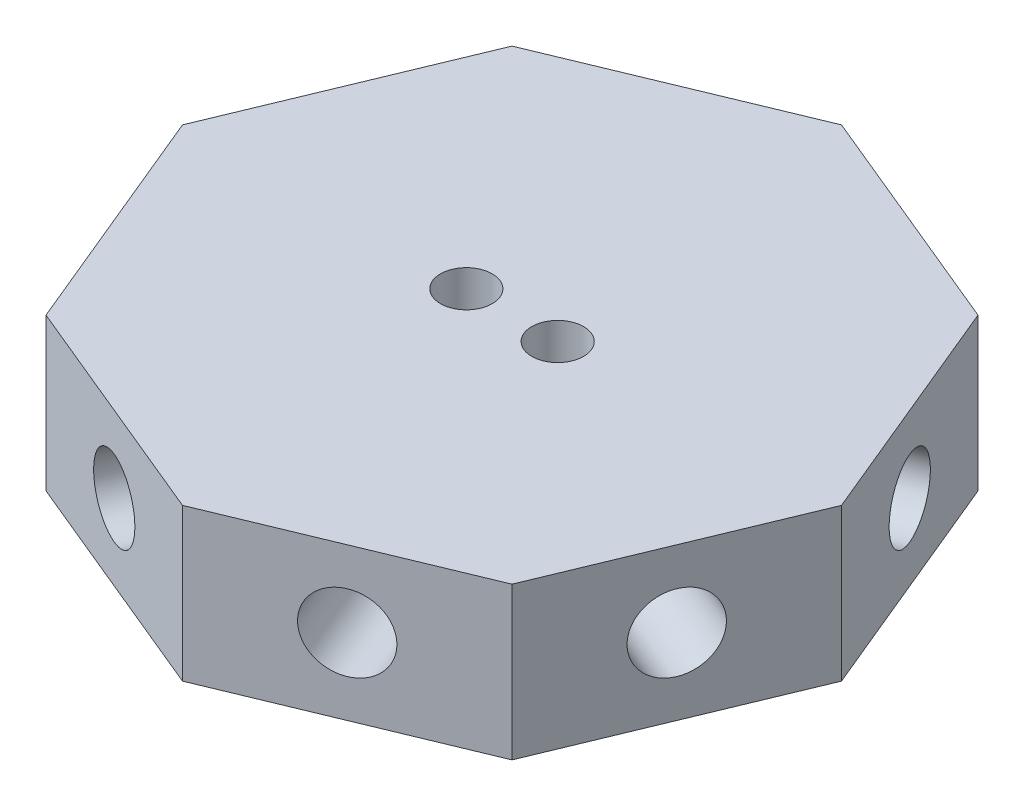
ISO-10303-21;
HEADER;
FILE_DESCRIPTION(('STEP AP214'),'2;1');
FILE_NAME('part.step','',(''),(''),'','','');
FILE_SCHEMA(('AUTOMOTIVE_DESIGN { 1 0 10303 214 1 1 1 1 }'));
ENDSEC;
DATA;
#1=APPLICATION_CONTEXT('core data for automotive mechanical design processes');
#2=APPLICATION_PROTOCOL_DEFINITION('international standard','automotive_design',2000,#1);
#3=PRODUCT_CONTEXT('',#1,'mechanical');
#4=PRODUCT('Part','Part','',(#3));
#5=PRODUCT_RELATED_PRODUCT_CATEGORY('part','',(#4));
#6=PRODUCT_DEFINITION_FORMATION('','',#4);
#7=PRODUCT_DEFINITION_CONTEXT('part definition',#1,'design');
#8=PRODUCT_DEFINITION('design','',#6,#7);
#9=PRODUCT_DEFINITION_SHAPE('','',#8);
#10=(LENGTH_UNIT() NAMED_UNIT(*) SI_UNIT(.MILLI.,.METRE.));
#11=(NAMED_UNIT(*) PLANE_ANGLE_UNIT() SI_UNIT($,.RADIAN.));
#12=(NAMED_UNIT(*) SI_UNIT($,.STERADIAN.) SOLID_ANGLE_UNIT());
#13=UNCERTAINTY_MEASURE_WITH_UNIT(LENGTH_MEASURE(1.E-05),#10,'distance_accuracy_value','');
#14=(GEOMETRIC_REPRESENTATION_CONTEXT(3) GLOBAL_UNCERTAINTY_ASSIGNED_CONTEXT((#13)) GLOBAL_UNIT_ASSIGNED_CONTEXT((#10,
#11,#12)) REPRESENTATION_CONTEXT('',''));
#15=CARTESIAN_POINT('',(0.,0.,0.));
#16=DIRECTION('',(0.,0.,1.));
#17=DIRECTION('',(1.,0.,0.));
#18=AXIS2_PLACEMENT_3D('',#15,#16,#17);
#19=CARTESIAN_POINT('',(0.,6.35,0.));
#20=DIRECTION('',(0.,1.,0.));
#21=DIRECTION('',(0.,0.,1.));
#22=AXIS2_PLACEMENT_3D('',#19,#20,#21);
#23=PLANE('',#22);
#24=CARTESIAN_POINT('',(1.905,6.35,0.));
#25=DIRECTION('',(0.,1.,0.));
#26=DIRECTION('',(0.,0.,1.));
#27=AXIS2_PLACEMENT_3D('',#24,#25,#26);
#28=CIRCLE('',#27,1.0795);
#29=CARTESIAN_POINT('',(1.905,6.35,1.0795));
#30=VERTEX_POINT('',#29);
#31=EDGE_CURVE('E152',#30,#30,#28,.T.);
#32=ORIENTED_EDGE('',*,*,#31,.F.);
#33=EDGE_LOOP('',(#32));
#34=FACE_BOUND('',#33,.T.);
#35=DIRECTION('',(-0.923879532511291,0.,-0.38268343236508));
#36=VECTOR('',#35,1.);
#37=CARTESIAN_POINT('',(9.72015918207318,6.35,-9.72015918207338));
#38=LINE('',#37,#36);
#39=CARTESIAN_POINT('',(9.72015918207318,6.35,-9.72015918207338));
#40=VERTEX_POINT('',#39);
#41=CARTESIAN_POINT('',(-1.37932681645812E-13,6.35,-13.7463809437134));
#42=VERTEX_POINT('',#41);
#43=EDGE_CURVE('E170',#40,#42,#38,.T.);
#44=ORIENTED_EDGE('',*,*,#43,.T.);
#45=DIRECTION('',(-0.923879532511283,0.,0.382683432365099));
#46=VECTOR('',#45,1.);
#47=CARTESIAN_POINT('',(-1.37932681645812E-13,6.35,-13.7463809437134));
#48=LINE('',#47,#46);
#49=CARTESIAN_POINT('',(-9.72015918207337,6.35,-9.72015918207318));
#50=VERTEX_POINT('',#49);
#51=EDGE_CURVE('E106',#42,#50,#48,.T.);
#52=ORIENTED_EDGE('',*,*,#51,.T.);
#53=DIRECTION('',(-0.38268343236508,0.,0.923879532511291));
#54=VECTOR('',#53,1.);
#55=CARTESIAN_POINT('',(-9.72015918207337,6.35,-9.72015918207318));
#56=LINE('',#55,#54);
#57=CARTESIAN_POINT('',(-13.7463809437134,6.35,1.37932681645812E-13));
#58=VERTEX_POINT('',#57);
#59=EDGE_CURVE('E191',#50,#58,#56,.T.);
#60=ORIENTED_EDGE('',*,*,#59,.T.);
#61=DIRECTION('',(0.382683432365099,0.,0.923879532511283));
#62=VECTOR('',#61,1.);
#63=CARTESIAN_POINT('',(-13.7463809437134,6.35,1.37932681645812E-13));
#64=LINE('',#63,#62);
#65=CARTESIAN_POINT('',(-9.72015918207318,6.35,9.72015918207337));
#66=VERTEX_POINT('',#65);
#67=EDGE_CURVE('E205',#58,#66,#64,.T.);
#68=ORIENTED_EDGE('',*,*,#67,.T.);
#69=DIRECTION('',(0.923879532511291,0.,0.38268343236508));
#70=VECTOR('',#69,1.);
#71=CARTESIAN_POINT('',(-9.72015918207318,6.35,9.72015918207337));
#72=LINE('',#71,#70);
#73=CARTESIAN_POINT('',(1.37337229226791E-13,6.35,13.7463809437134));
#74=VERTEX_POINT('',#73);
#75=EDGE_CURVE('E125',#66,#74,#72,.T.);
#76=ORIENTED_EDGE('',*,*,#75,.T.);
#77=DIRECTION('',(0.923879532511283,0.,-0.382683432365099));
#78=VECTOR('',#77,1.);
#79=CARTESIAN_POINT('',(1.37337229226791E-13,6.35,13.7463809437134));
#80=LINE('',#79,#78);
#81=CARTESIAN_POINT('',(9.72015918207338,6.35,9.72015918207318));
#82=VERTEX_POINT('',#81);
#83=EDGE_CURVE('E119',#74,#82,#80,.T.);
#84=ORIENTED_EDGE('',*,*,#83,.T.);
#85=DIRECTION('',(0.382683432365081,0.,-0.923879532511291));
#86=VECTOR('',#85,1.);
#87=CARTESIAN_POINT('',(9.72015918207338,6.35,9.72015918207318));
#88=LINE('',#87,#86);
#89=CARTESIAN_POINT('',(13.7463809437134,6.35,-1.34091256162712E-13));
#90=VERTEX_POINT('',#89);
#91=EDGE_CURVE('E123',#82,#90,#88,.T.);
#92=ORIENTED_EDGE('',*,*,#91,.T.);
#93=DIRECTION('',(-0.382683432365099,0.,-0.923879532511283));
#94=VECTOR('',#93,1.);
#95=CARTESIAN_POINT('',(13.7463809437134,6.35,-1.34091256162712E-13));
#96=LINE('',#95,#94);
#97=EDGE_CURVE('E63',#90,#40,#96,.T.);
#98=ORIENTED_EDGE('',*,*,#97,.T.);
#99=EDGE_LOOP('',(#44,#52,#60,#68,#76,#84,#92,#98));
#100=FACE_BOUND('',#99,.T.);
#101=CARTESIAN_POINT('',(-1.905,6.35,0.));
#102=DIRECTION('',(0.,1.,0.));
#103=DIRECTION('',(0.,0.,1.));
#104=AXIS2_PLACEMENT_3D('',#101,#102,#103);
#105=CIRCLE('',#104,1.0795);
#106=CARTESIAN_POINT('',(-1.905,6.35,1.0795));
#107=VERTEX_POINT('',#106);
#108=EDGE_CURVE('E219',#107,#107,#105,.T.);
#109=ORIENTED_EDGE('',*,*,#108,.F.);
#110=EDGE_LOOP('',(#109));
#111=FACE_BOUND('',#110,.T.);
#112=ADVANCED_FACE('F45',(#34,#100,#111),#23,.T.);
#113=CARTESIAN_POINT('',(0.,0.,0.));
#114=DIRECTION('',(0.,1.,0.));
#115=DIRECTION('',(0.,0.,1.));
#116=AXIS2_PLACEMENT_3D('',#113,#114,#115);
#117=PLANE('',#116);
#118=DIRECTION('',(-0.923879532511291,0.,-0.38268343236508));
#119=VECTOR('',#118,1.);
#120=CARTESIAN_POINT('',(9.72015918207318,0.,-9.72015918207338));
#121=LINE('',#120,#119);
#122=CARTESIAN_POINT('',(9.72015918207318,0.,-9.72015918207338));
#123=VERTEX_POINT('',#122);
#124=CARTESIAN_POINT('',(-1.37932681645812E-13,0.,-13.7463809437134));
#125=VERTEX_POINT('',#124);
#126=EDGE_CURVE('E147',#123,#125,#121,.T.);
#127=ORIENTED_EDGE('',*,*,#126,.F.);
#128=DIRECTION('',(-0.382683432365099,0.,-0.923879532511283));
#129=VECTOR('',#128,1.);
#130=CARTESIAN_POINT('',(13.7463809437134,0.,-1.34091256162712E-13));
#131=LINE('',#130,#129);
#132=CARTESIAN_POINT('',(13.7463809437134,0.,-1.34091256162712E-13));
#133=VERTEX_POINT('',#132);
#134=EDGE_CURVE('E98',#133,#123,#131,.T.);
#135=ORIENTED_EDGE('',*,*,#134,.F.);
#136=DIRECTION('',(0.382683432365081,0.,-0.923879532511291));
#137=VECTOR('',#136,1.);
#138=CARTESIAN_POINT('',(9.72015918207338,0.,9.72015918207318));
#139=LINE('',#138,#137);
#140=CARTESIAN_POINT('',(9.72015918207338,0.,9.72015918207318));
#141=VERTEX_POINT('',#140);
#142=EDGE_CURVE('E92',#141,#133,#139,.T.);
#143=ORIENTED_EDGE('',*,*,#142,.F.);
#144=DIRECTION('',(0.923879532511283,0.,-0.382683432365099));
#145=VECTOR('',#144,1.);
#146=CARTESIAN_POINT('',(1.37337229226791E-13,0.,13.7463809437134));
#147=LINE('',#146,#145);
#148=CARTESIAN_POINT('',(1.37337229226791E-13,0.,13.7463809437134));
#149=VERTEX_POINT('',#148);
#150=EDGE_CURVE('E134',#149,#141,#147,.T.);
#151=ORIENTED_EDGE('',*,*,#150,.F.);
#152=DIRECTION('',(0.923879532511291,0.,0.38268343236508));
#153=VECTOR('',#152,1.);
#154=CARTESIAN_POINT('',(-9.72015918207318,0.,9.72015918207337));
#155=LINE('',#154,#153);
#156=CARTESIAN_POINT('',(-9.72015918207318,0.,9.72015918207337));
#157=VERTEX_POINT('',#156);
#158=EDGE_CURVE('E161',#157,#149,#155,.T.);
#159=ORIENTED_EDGE('',*,*,#158,.F.);
#160=DIRECTION('',(0.382683432365099,0.,0.923879532511283));
#161=VECTOR('',#160,1.);
#162=CARTESIAN_POINT('',(-13.7463809437134,0.,1.37932681645812E-13));
#163=LINE('',#162,#161);
#164=CARTESIAN_POINT('',(-13.7463809437134,0.,1.37932681645812E-13));
#165=VERTEX_POINT('',#164);
#166=EDGE_CURVE('E158',#165,#157,#163,.T.);
#167=ORIENTED_EDGE('',*,*,#166,.F.);
#168=DIRECTION('',(-0.38268343236508,0.,0.923879532511291));
#169=VECTOR('',#168,1.);
#170=CARTESIAN_POINT('',(-9.72015918207337,0.,-9.72015918207318));
#171=LINE('',#170,#169);
#172=CARTESIAN_POINT('',(-9.72015918207337,0.,-9.72015918207318));
#173=VERTEX_POINT('',#172);
#174=EDGE_CURVE('E155',#173,#165,#171,.T.);
#175=ORIENTED_EDGE('',*,*,#174,.F.);
#176=DIRECTION('',(-0.923879532511283,0.,0.382683432365099));
#177=VECTOR('',#176,1.);
#178=CARTESIAN_POINT('',(-1.37932681645812E-13,0.,-13.7463809437134));
#179=LINE('',#178,#177);
#180=EDGE_CURVE('E151',#125,#173,#179,.T.);
#181=ORIENTED_EDGE('',*,*,#180,.F.);
#182=EDGE_LOOP('',(#127,#135,#143,#151,#159,#167,#175,#181));
#183=FACE_BOUND('',#182,.T.);
#184=CARTESIAN_POINT('',(1.905,0.,0.));
#185=DIRECTION('',(0.,1.,0.));
#186=DIRECTION('',(0.,0.,1.));
#187=AXIS2_PLACEMENT_3D('',#184,#185,#186);
#188=CIRCLE('',#187,1.0795);
#189=CARTESIAN_POINT('',(1.905,0.,1.0795));
#190=VERTEX_POINT('',#189);
#191=EDGE_CURVE('E215',#190,#190,#188,.T.);
#192=ORIENTED_EDGE('',*,*,#191,.T.);
#193=EDGE_LOOP('',(#192));
#194=FACE_BOUND('',#193,.T.);
#195=CARTESIAN_POINT('',(-1.905,0.,0.));
#196=DIRECTION('',(0.,1.,0.));
#197=DIRECTION('',(0.,0.,1.));
#198=AXIS2_PLACEMENT_3D('',#195,#196,#197);
#199=CIRCLE('',#198,1.0795);
#200=CARTESIAN_POINT('',(-1.905,0.,1.0795));
#201=VERTEX_POINT('',#200);
#202=EDGE_CURVE('E223',#201,#201,#199,.T.);
#203=ORIENTED_EDGE('',*,*,#202,.T.);
#204=EDGE_LOOP('',(#203));
#205=FACE_BOUND('',#204,.T.);
#206=ADVANCED_FACE('F195',(#183,#194,#205),#117,.F.);
#207=CARTESIAN_POINT('',(9.72015918207318,6.35,-9.72015918207338));
#208=DIRECTION('',(-0.38268343236508,0.,0.923879532511291));
#209=DIRECTION('',(0.923879532511291,0.,0.38268343236508));
#210=AXIS2_PLACEMENT_3D('',#207,#208,#209);
#211=PLANE('',#210);
#212=CARTESIAN_POINT('',(4.86007959103652,3.175,-11.7332700628934));
#213=DIRECTION('',(0.382683432365081,0.,-0.923879532511291));
#214=DIRECTION('',(-0.923879532511291,0.,-0.382683432365081));
#215=AXIS2_PLACEMENT_3D('',#212,#213,#214);
#216=CIRCLE('',#215,1.5875);
#217=CARTESIAN_POINT('',(3.39342083317485,3.175,-12.340780011773));
#218=VERTEX_POINT('',#217);
#219=EDGE_CURVE('E272',#218,#218,#216,.T.);
#220=ORIENTED_EDGE('',*,*,#219,.F.);
#221=EDGE_LOOP('',(#220));
#222=FACE_BOUND('',#221,.T.);
#223=ORIENTED_EDGE('',*,*,#126,.T.);
#224=DIRECTION('',(0.,-1.,0.));
#225=VECTOR('',#224,1.);
#226=CARTESIAN_POINT('',(-1.37932681645812E-13,6.35,-13.7463809437134));
#227=LINE('',#226,#225);
#228=EDGE_CURVE('E11',#42,#125,#227,.T.);
#229=ORIENTED_EDGE('',*,*,#228,.F.);
#230=ORIENTED_EDGE('',*,*,#43,.F.);
#231=DIRECTION('',(0.,-1.,0.));
#232=VECTOR('',#231,1.);
#233=CARTESIAN_POINT('',(9.72015918207318,6.35,-9.72015918207338));
#234=LINE('',#233,#232);
#235=EDGE_CURVE('E143',#40,#123,#234,.T.);
#236=ORIENTED_EDGE('',*,*,#235,.T.);
#237=EDGE_LOOP('',(#223,#229,#230,#236));
#238=FACE_BOUND('',#237,.T.);
#239=ADVANCED_FACE('F47',(#222,#238),#211,.F.);
#240=CARTESIAN_POINT('',(-1.37932681645812E-13,6.35,-13.7463809437134));
#241=DIRECTION('',(0.382683432365099,0.,0.923879532511283));
#242=DIRECTION('',(0.923879532511283,0.,-0.382683432365099));
#243=AXIS2_PLACEMENT_3D('',#240,#241,#242);
#244=PLANE('',#243);
#245=CARTESIAN_POINT('',(-4.86007959103686,3.175,-11.7332700628932));
#246=DIRECTION('',(-0.382683432365107,0.,-0.92387953251128));
#247=DIRECTION('',(-0.92387953251128,0.,0.382683432365107));
#248=AXIS2_PLACEMENT_3D('',#245,#246,#247);
#249=CIRCLE('',#248,1.5875);
#250=CARTESIAN_POINT('',(-6.32673834889851,3.175,-11.1257601140136));
#251=VERTEX_POINT('',#250);
#252=EDGE_CURVE('E263',#251,#251,#249,.T.);
#253=ORIENTED_EDGE('',*,*,#252,.F.);
#254=EDGE_LOOP('',(#253));
#255=FACE_BOUND('',#254,.T.);
#256=ORIENTED_EDGE('',*,*,#180,.T.);
#257=DIRECTION('',(0.,-1.,0.));
#258=VECTOR('',#257,1.);
#259=CARTESIAN_POINT('',(-9.72015918207337,6.35,-9.72015918207318));
#260=LINE('',#259,#258);
#261=EDGE_CURVE('E55',#50,#173,#260,.T.);
#262=ORIENTED_EDGE('',*,*,#261,.F.);
#263=ORIENTED_EDGE('',*,*,#51,.F.);
#264=ORIENTED_EDGE('',*,*,#228,.T.);
#265=EDGE_LOOP('',(#256,#262,#263,#264));
#266=FACE_BOUND('',#265,.T.);
#267=ADVANCED_FACE('F305',(#255,#266),#244,.F.);
#268=CARTESIAN_POINT('',(-9.72015918207337,6.35,-9.72015918207318));
#269=DIRECTION('',(0.923879532511291,0.,0.38268343236508));
#270=DIRECTION('',(0.38268343236508,0.,-0.923879532511291));
#271=AXIS2_PLACEMENT_3D('',#268,#269,#270);
#272=PLANE('',#271);
#273=CARTESIAN_POINT('',(-11.7332700628934,3.175,-4.8600795910364));
#274=DIRECTION('',(-0.923879532511295,0.,-0.382683432365071));
#275=DIRECTION('',(-0.382683432365071,0.,0.923879532511295));
#276=AXIS2_PLACEMENT_3D('',#273,#274,#275);
#277=CIRCLE('',#276,1.5875);
#278=CARTESIAN_POINT('',(-12.340780011773,3.175,-3.39342083317472));
#279=VERTEX_POINT('',#278);
#280=EDGE_CURVE('E287',#279,#279,#277,.T.);
#281=ORIENTED_EDGE('',*,*,#280,.F.);
#282=EDGE_LOOP('',(#281));
#283=FACE_BOUND('',#282,.T.);
#284=ORIENTED_EDGE('',*,*,#174,.T.);
#285=DIRECTION('',(0.,-1.,0.));
#286=VECTOR('',#285,1.);
#287=CARTESIAN_POINT('',(-13.7463809437134,6.35,1.37932681645812E-13));
#288=LINE('',#287,#286);
#289=EDGE_CURVE('E181',#58,#165,#288,.T.);
#290=ORIENTED_EDGE('',*,*,#289,.F.);
#291=ORIENTED_EDGE('',*,*,#59,.F.);
#292=ORIENTED_EDGE('',*,*,#261,.T.);
#293=EDGE_LOOP('',(#284,#290,#291,#292));
#294=FACE_BOUND('',#293,.T.);
#295=ADVANCED_FACE('F189',(#283,#294),#272,.F.);
#296=CARTESIAN_POINT('',(-13.7463809437134,6.35,1.37932681645812E-13));
#297=DIRECTION('',(0.923879532511283,0.,-0.382683432365099));
#298=DIRECTION('',(-0.382683432365099,0.,-0.923879532511283));
#299=AXIS2_PLACEMENT_3D('',#296,#297,#298);
#300=PLANE('',#299);
#301=CARTESIAN_POINT('',(-11.7332700628932,3.175,4.8600795910369));
#302=DIRECTION('',(-0.923879532511278,0.,0.38268343236511));
#303=DIRECTION('',(0.38268343236511,0.,0.923879532511278));
#304=AXIS2_PLACEMENT_3D('',#301,#302,#303);
#305=CIRCLE('',#304,1.5875);
#306=CARTESIAN_POINT('',(-11.1257601140136,3.175,6.32673834889855));
#307=VERTEX_POINT('',#306);
#308=EDGE_CURVE('E279',#307,#307,#305,.T.);
#309=ORIENTED_EDGE('',*,*,#308,.F.);
#310=EDGE_LOOP('',(#309));
#311=FACE_BOUND('',#310,.T.);
#312=ORIENTED_EDGE('',*,*,#166,.T.);
#313=DIRECTION('',(0.,-1.,0.));
#314=VECTOR('',#313,1.);
#315=CARTESIAN_POINT('',(-9.72015918207318,6.35,9.72015918207337));
#316=LINE('',#315,#314);
#317=EDGE_CURVE('E177',#66,#157,#316,.T.);
#318=ORIENTED_EDGE('',*,*,#317,.F.);
#319=ORIENTED_EDGE('',*,*,#67,.F.);
#320=ORIENTED_EDGE('',*,*,#289,.T.);
#321=EDGE_LOOP('',(#312,#318,#319,#320));
#322=FACE_BOUND('',#321,.T.);
#323=ADVANCED_FACE('F200',(#311,#322),#300,.F.);
#324=CARTESIAN_POINT('',(-9.72015918207318,6.35,9.72015918207337));
#325=DIRECTION('',(0.38268343236508,0.,-0.923879532511291));
#326=DIRECTION('',(-0.923879532511291,0.,-0.382683432365081));
#327=AXIS2_PLACEMENT_3D('',#324,#325,#326);
#328=PLANE('',#327);
#329=CARTESIAN_POINT('',(-4.86007959103652,3.175,11.7332700628934));
#330=DIRECTION('',(-0.382683432365081,0.,0.923879532511291));
#331=DIRECTION('',(0.923879532511291,0.,0.382683432365081));
#332=AXIS2_PLACEMENT_3D('',#329,#330,#331);
#333=CIRCLE('',#332,1.5875);
#334=CARTESIAN_POINT('',(-3.39342083317485,3.175,12.340780011773));
#335=VERTEX_POINT('',#334);
#336=EDGE_CURVE('E231',#335,#335,#333,.T.);
#337=ORIENTED_EDGE('',*,*,#336,.F.);
#338=EDGE_LOOP('',(#337));
#339=FACE_BOUND('',#338,.T.);
#340=ORIENTED_EDGE('',*,*,#158,.T.);
#341=DIRECTION('',(0.,-1.,0.));
#342=VECTOR('',#341,1.);
#343=CARTESIAN_POINT('',(1.37337229226791E-13,6.35,13.7463809437134));
#344=LINE('',#343,#342);
#345=EDGE_CURVE('E136',#74,#149,#344,.T.);
#346=ORIENTED_EDGE('',*,*,#345,.F.);
#347=ORIENTED_EDGE('',*,*,#75,.F.);
#348=ORIENTED_EDGE('',*,*,#317,.T.);
#349=EDGE_LOOP('',(#340,#346,#347,#348));
#350=FACE_BOUND('',#349,.T.);
#351=ADVANCED_FACE('F203',(#339,#350),#328,.F.);
#352=CARTESIAN_POINT('',(1.37337229226791E-13,6.35,13.7463809437134));
#353=DIRECTION('',(-0.382683432365099,0.,-0.923879532511283));
#354=DIRECTION('',(-0.923879532511283,0.,0.382683432365099));
#355=AXIS2_PLACEMENT_3D('',#352,#353,#354);
#356=PLANE('',#355);
#357=CARTESIAN_POINT('',(4.86007959103678,3.175,11.7332700628933));
#358=DIRECTION('',(0.3826834323651,0.,0.923879532511282));
#359=DIRECTION('',(0.923879532511282,0.,-0.3826834323651));
#360=AXIS2_PLACEMENT_3D('',#357,#358,#359);
#361=CIRCLE('',#360,1.5875);
#362=CARTESIAN_POINT('',(6.32673834889844,3.175,11.1257601140137));
#363=VERTEX_POINT('',#362);
#364=EDGE_CURVE('E239',#363,#363,#361,.T.);
#365=ORIENTED_EDGE('',*,*,#364,.F.);
#366=EDGE_LOOP('',(#365));
#367=FACE_BOUND('',#366,.T.);
#368=ORIENTED_EDGE('',*,*,#150,.T.);
#369=DIRECTION('',(0.,-1.,0.));
#370=VECTOR('',#369,1.);
#371=CARTESIAN_POINT('',(9.72015918207338,6.35,9.72015918207318));
#372=LINE('',#371,#370);
#373=EDGE_CURVE('E131',#82,#141,#372,.T.);
#374=ORIENTED_EDGE('',*,*,#373,.F.);
#375=ORIENTED_EDGE('',*,*,#83,.F.);
#376=ORIENTED_EDGE('',*,*,#345,.T.);
#377=EDGE_LOOP('',(#368,#374,#375,#376));
#378=FACE_BOUND('',#377,.T.);
#379=ADVANCED_FACE('F132',(#367,#378),#356,.F.);
#380=CARTESIAN_POINT('',(9.72015918207338,6.35,9.72015918207318));
#381=DIRECTION('',(-0.923879532511291,0.,-0.382683432365081));
#382=DIRECTION('',(-0.382683432365081,0.,0.923879532511291));
#383=AXIS2_PLACEMENT_3D('',#380,#381,#382);
#384=PLANE('',#383);
#385=CARTESIAN_POINT('',(11.7332700628934,3.175,4.86007959103648));
#386=DIRECTION('',(0.923879532511292,0.,0.382683432365077));
#387=DIRECTION('',(0.382683432365077,0.,-0.923879532511292));
#388=AXIS2_PLACEMENT_3D('',#385,#386,#387);
#389=CIRCLE('',#388,1.5875);
#390=CARTESIAN_POINT('',(12.340780011773,3.175,3.39342083317481));
#391=VERTEX_POINT('',#390);
#392=EDGE_CURVE('E256',#391,#391,#389,.T.);
#393=ORIENTED_EDGE('',*,*,#392,.F.);
#394=EDGE_LOOP('',(#393));
#395=FACE_BOUND('',#394,.T.);
#396=ORIENTED_EDGE('',*,*,#142,.T.);
#397=DIRECTION('',(0.,-1.,0.));
#398=VECTOR('',#397,1.);
#399=CARTESIAN_POINT('',(13.7463809437134,6.35,-1.34091256162712E-13));
#400=LINE('',#399,#398);
#401=EDGE_CURVE('E137',#90,#133,#400,.T.);
#402=ORIENTED_EDGE('',*,*,#401,.F.);
#403=ORIENTED_EDGE('',*,*,#91,.F.);
#404=ORIENTED_EDGE('',*,*,#373,.T.);
#405=EDGE_LOOP('',(#396,#402,#403,#404));
#406=FACE_BOUND('',#405,.T.);
#407=ADVANCED_FACE('F139',(#395,#406),#384,.F.);
#408=CARTESIAN_POINT('',(13.7463809437134,6.35,-1.34091256162712E-13));
#409=DIRECTION('',(-0.923879532511283,0.,0.382683432365099));
#410=DIRECTION('',(0.382683432365099,0.,0.923879532511283));
#411=AXIS2_PLACEMENT_3D('',#408,#409,#410);
#412=PLANE('',#411);
#413=CARTESIAN_POINT('',(11.7332700628933,3.175,-4.86007959103682));
#414=DIRECTION('',(0.923879532511281,0.,-0.382683432365104));
#415=DIRECTION('',(-0.382683432365104,0.,-0.923879532511281));
#416=AXIS2_PLACEMENT_3D('',#413,#414,#415);
#417=CIRCLE('',#416,1.5875);
#418=CARTESIAN_POINT('',(11.1257601140137,3.175,-6.32673834889847));
#419=VERTEX_POINT('',#418);
#420=EDGE_CURVE('E247',#419,#419,#417,.T.);
#421=ORIENTED_EDGE('',*,*,#420,.F.);
#422=EDGE_LOOP('',(#421));
#423=FACE_BOUND('',#422,.T.);
#424=ORIENTED_EDGE('',*,*,#134,.T.);
#425=ORIENTED_EDGE('',*,*,#235,.F.);
#426=ORIENTED_EDGE('',*,*,#97,.F.);
#427=ORIENTED_EDGE('',*,*,#401,.T.);
#428=EDGE_LOOP('',(#424,#425,#426,#427));
#429=FACE_BOUND('',#428,.T.);
#430=ADVANCED_FACE('F326',(#423,#429),#412,.F.);
#431=CARTESIAN_POINT('',(1.905,6.35,0.));
#432=DIRECTION('',(0.,-1.,0.));
#433=DIRECTION('',(0.,0.,-1.));
#434=AXIS2_PLACEMENT_3D('',#431,#432,#433);
#435=CYLINDRICAL_SURFACE('',#434,1.0795);
#436=ORIENTED_EDGE('',*,*,#31,.T.);
#437=EDGE_LOOP('',(#436));
#438=FACE_BOUND('',#437,.T.);
#439=ORIENTED_EDGE('',*,*,#191,.F.);
#440=EDGE_LOOP('',(#439));
#441=FACE_BOUND('',#440,.T.);
#442=ADVANCED_FACE('F323',(#438,#441),#435,.F.);
#443=CARTESIAN_POINT('',(-1.905,6.35,0.));
#444=DIRECTION('',(0.,-1.,0.));
#445=DIRECTION('',(0.,0.,-1.));
#446=AXIS2_PLACEMENT_3D('',#443,#444,#445);
#447=CYLINDRICAL_SURFACE('',#446,1.0795);
#448=ORIENTED_EDGE('',*,*,#108,.T.);
#449=EDGE_LOOP('',(#448));
#450=FACE_BOUND('',#449,.T.);
#451=ORIENTED_EDGE('',*,*,#202,.F.);
#452=EDGE_LOOP('',(#451));
#453=FACE_BOUND('',#452,.T.);
#454=ADVANCED_FACE('F346',(#450,#453),#447,.F.);
#455=CARTESIAN_POINT('',(-1.94403183641461,3.175,4.69330802515735));
#456=DIRECTION('',(-0.382683432365081,0.,0.923879532511291));
#457=DIRECTION('',(0.923879532511291,0.,0.382683432365081));
#458=AXIS2_PLACEMENT_3D('',#455,#456,#457);
#459=CYLINDRICAL_SURFACE('',#458,1.5875);
#460=CARTESIAN_POINT('',(-1.94403183641461,3.175,4.69330802515735));
#461=DIRECTION('',(-0.382683432365081,0.,0.923879532511291));
#462=DIRECTION('',(0.923879532511291,0.,0.382683432365081));
#463=AXIS2_PLACEMENT_3D('',#460,#461,#462);
#464=CIRCLE('',#463,1.5875);
#465=CARTESIAN_POINT('',(-0.477373078552936,3.175,5.30081797403692));
#466=VERTEX_POINT('',#465);
#467=EDGE_CURVE('E227',#466,#466,#464,.T.);
#468=ORIENTED_EDGE('',*,*,#467,.F.);
#469=EDGE_LOOP('',(#468));
#470=FACE_BOUND('',#469,.T.);
#471=ORIENTED_EDGE('',*,*,#336,.T.);
#472=EDGE_LOOP('',(#471));
#473=FACE_BOUND('',#472,.T.);
#474=ADVANCED_FACE('F344',(#470,#473),#459,.F.);
#475=CARTESIAN_POINT('',(-1.94403183641461,3.175,4.69330802515735));
#476=DIRECTION('',(-0.382683432365081,0.,0.923879532511291));
#477=DIRECTION('',(0.923879532511291,0.,0.382683432365081));
#478=AXIS2_PLACEMENT_3D('',#475,#476,#477);
#479=PLANE('',#478);
#480=ORIENTED_EDGE('',*,*,#467,.T.);
#481=EDGE_LOOP('',(#480));
#482=FACE_BOUND('',#481,.T.);
#483=ADVANCED_FACE('F345',(#482),#479,.T.);
#484=CARTESIAN_POINT('',(4.69330802515731,3.175,-1.94403183641473));
#485=DIRECTION('',(0.923879532511281,0.,-0.382683432365104));
#486=DIRECTION('',(-0.382683432365104,0.,-0.923879532511281));
#487=AXIS2_PLACEMENT_3D('',#484,#485,#486);
#488=CYLINDRICAL_SURFACE('',#487,1.5875);
#489=CARTESIAN_POINT('',(4.69330802515731,3.175,-1.94403183641473));
#490=DIRECTION('',(0.923879532511281,0.,-0.382683432365104));
#491=DIRECTION('',(-0.382683432365104,0.,-0.923879532511281));
#492=AXIS2_PLACEMENT_3D('',#489,#490,#491);
#493=CIRCLE('',#492,1.5875);
#494=CARTESIAN_POINT('',(4.0857980762777,3.175,-3.41069059427638));
#495=VERTEX_POINT('',#494);
#496=EDGE_CURVE('E251',#495,#495,#493,.T.);
#497=ORIENTED_EDGE('',*,*,#496,.F.);
#498=EDGE_LOOP('',(#497));
#499=FACE_BOUND('',#498,.T.);
#500=ORIENTED_EDGE('',*,*,#420,.T.);
#501=EDGE_LOOP('',(#500));
#502=FACE_BOUND('',#501,.T.);
#503=ADVANCED_FACE('F352',(#499,#502),#488,.F.);
#504=CARTESIAN_POINT('',(4.69330802515731,3.175,-1.94403183641473));
#505=DIRECTION('',(0.923879532511281,0.,-0.382683432365104));
#506=DIRECTION('',(-0.382683432365104,0.,-0.923879532511281));
#507=AXIS2_PLACEMENT_3D('',#504,#505,#506);
#508=PLANE('',#507);
#509=ORIENTED_EDGE('',*,*,#496,.T.);
#510=EDGE_LOOP('',(#509));
#511=FACE_BOUND('',#510,.T.);
#512=ADVANCED_FACE('F370',(#511),#508,.T.);
#513=CARTESIAN_POINT('',(4.69330802515736,3.175,1.94403183641459));
#514=DIRECTION('',(0.923879532511292,0.,0.382683432365077));
#515=DIRECTION('',(0.382683432365077,0.,-0.923879532511292));
#516=AXIS2_PLACEMENT_3D('',#513,#514,#515);
#517=CYLINDRICAL_SURFACE('',#516,1.5875);
#518=CARTESIAN_POINT('',(4.69330802515736,3.175,1.94403183641459));
#519=DIRECTION('',(0.923879532511292,0.,0.382683432365077));
#520=DIRECTION('',(0.382683432365077,0.,-0.923879532511292));
#521=AXIS2_PLACEMENT_3D('',#518,#519,#520);
#522=CIRCLE('',#521,1.5875);
#523=CARTESIAN_POINT('',(5.30081797403692,3.175,0.477373078552917));
#524=VERTEX_POINT('',#523);
#525=EDGE_CURVE('E243',#524,#524,#522,.T.);
#526=ORIENTED_EDGE('',*,*,#525,.F.);
#527=EDGE_LOOP('',(#526));
#528=FACE_BOUND('',#527,.T.);
#529=ORIENTED_EDGE('',*,*,#392,.T.);
#530=EDGE_LOOP('',(#529));
#531=FACE_BOUND('',#530,.T.);
#532=ADVANCED_FACE('F374',(#528,#531),#517,.F.);
#533=CARTESIAN_POINT('',(4.69330802515736,3.175,1.94403183641459));
#534=DIRECTION('',(0.923879532511292,0.,0.382683432365077));
#535=DIRECTION('',(0.382683432365077,0.,-0.923879532511292));
#536=AXIS2_PLACEMENT_3D('',#533,#534,#535);
#537=PLANE('',#536);
#538=ORIENTED_EDGE('',*,*,#525,.T.);
#539=EDGE_LOOP('',(#538));
#540=FACE_BOUND('',#539,.T.);
#541=ADVANCED_FACE('F362',(#540),#537,.T.);
#542=CARTESIAN_POINT('',(1.94403183641471,3.175,4.69330802515731));
#543=DIRECTION('',(0.382683432365101,0.,0.923879532511282));
#544=DIRECTION('',(0.923879532511282,0.,-0.382683432365101));
#545=AXIS2_PLACEMENT_3D('',#542,#543,#544);
#546=CYLINDRICAL_SURFACE('',#545,1.5875);
#547=CARTESIAN_POINT('',(1.94403183641471,3.175,4.69330802515731));
#548=DIRECTION('',(0.3826834323651,0.,0.923879532511282));
#549=DIRECTION('',(0.923879532511282,0.,-0.3826834323651));
#550=AXIS2_PLACEMENT_3D('',#547,#548,#549);
#551=CIRCLE('',#550,1.5875);
#552=CARTESIAN_POINT('',(3.41069059427637,3.175,4.08579807627772));
#553=VERTEX_POINT('',#552);
#554=EDGE_CURVE('E235',#553,#553,#551,.T.);
#555=ORIENTED_EDGE('',*,*,#554,.F.);
#556=EDGE_LOOP('',(#555));
#557=FACE_BOUND('',#556,.T.);
#558=ORIENTED_EDGE('',*,*,#364,.T.);
#559=EDGE_LOOP('',(#558));
#560=FACE_BOUND('',#559,.T.);
#561=ADVANCED_FACE('F358',(#557,#560),#546,.F.);
#562=CARTESIAN_POINT('',(1.94403183641471,3.175,4.69330802515731));
#563=DIRECTION('',(0.3826834323651,0.,0.923879532511282));
#564=DIRECTION('',(0.923879532511282,0.,-0.3826834323651));
#565=AXIS2_PLACEMENT_3D('',#562,#563,#564);
#566=PLANE('',#565);
#567=ORIENTED_EDGE('',*,*,#554,.T.);
#568=EDGE_LOOP('',(#567));
#569=FACE_BOUND('',#568,.T.);
#570=ADVANCED_FACE('F361',(#569),#566,.T.);
#571=CARTESIAN_POINT('',(-4.69330802515729,3.175,1.94403183641476));
#572=DIRECTION('',(-0.923879532511278,0.,0.38268343236511));
#573=DIRECTION('',(0.38268343236511,0.,0.923879532511278));
#574=AXIS2_PLACEMENT_3D('',#571,#572,#573);
#575=CYLINDRICAL_SURFACE('',#574,1.5875);
#576=CARTESIAN_POINT('',(-4.69330802515729,3.175,1.94403183641476));
#577=DIRECTION('',(-0.923879532511278,0.,0.38268343236511));
#578=DIRECTION('',(0.38268343236511,0.,0.923879532511278));
#579=AXIS2_PLACEMENT_3D('',#576,#577,#578);
#580=CIRCLE('',#579,1.5875);
#581=CARTESIAN_POINT('',(-4.08579807627768,3.175,3.41069059427641));
#582=VERTEX_POINT('',#581);
#583=EDGE_CURVE('E283',#582,#582,#580,.T.);
#584=ORIENTED_EDGE('',*,*,#583,.F.);
#585=EDGE_LOOP('',(#584));
#586=FACE_BOUND('',#585,.T.);
#587=ORIENTED_EDGE('',*,*,#308,.T.);
#588=EDGE_LOOP('',(#587));
#589=FACE_BOUND('',#588,.T.);
#590=ADVANCED_FACE('F366',(#586,#589),#575,.F.);
#591=CARTESIAN_POINT('',(-4.69330802515729,3.175,1.94403183641476));
#592=DIRECTION('',(-0.923879532511278,0.,0.38268343236511));
#593=DIRECTION('',(0.38268343236511,0.,0.923879532511278));
#594=AXIS2_PLACEMENT_3D('',#591,#592,#593);
#595=PLANE('',#594);
#596=ORIENTED_EDGE('',*,*,#583,.T.);
#597=EDGE_LOOP('',(#596));
#598=FACE_BOUND('',#597,.T.);
#599=ADVANCED_FACE('F300',(#598),#595,.T.);
#600=CARTESIAN_POINT('',(-4.69330802515737,3.175,-1.94403183641456));
#601=DIRECTION('',(-0.923879532511295,0.,-0.382683432365071));
#602=DIRECTION('',(-0.382683432365071,0.,0.923879532511295));
#603=AXIS2_PLACEMENT_3D('',#600,#601,#602);
#604=CYLINDRICAL_SURFACE('',#603,1.5875);
#605=CARTESIAN_POINT('',(-4.69330802515737,3.175,-1.94403183641456));
#606=DIRECTION('',(-0.923879532511295,0.,-0.382683432365071));
#607=DIRECTION('',(-0.382683432365071,0.,0.923879532511295));
#608=AXIS2_PLACEMENT_3D('',#605,#606,#607);
#609=CIRCLE('',#608,1.5875);
#610=CARTESIAN_POINT('',(-5.30081797403692,3.175,-0.477373078552878));
#611=VERTEX_POINT('',#610);
#612=EDGE_CURVE('E268',#611,#611,#609,.T.);
#613=CARTESIAN_POINT('',(-5.30081797403692,3.175,-0.477373078552878));
#614=CARTESIAN_POINT('',(-5.37415091193001,3.175,-0.507748575996856));
#615=CARTESIAN_POINT('',(-5.44748384982309,3.175,-0.538124073440833));
#616=CARTESIAN_POINT('',(-5.59414972560926,3.175,-0.598875068328788));
#617=CARTESIAN_POINT('',(-5.66748266350234,3.175,-0.629250565772766));
#618=CARTESIAN_POINT('',(-5.81414853928851,3.175,-0.690001560660721));
#619=CARTESIAN_POINT('',(-5.88748147718159,3.175,-0.720377058104698));
#620=CARTESIAN_POINT('',(-6.03414735296776,3.175,-0.781128052992654));
#621=CARTESIAN_POINT('',(-6.10748029086085,3.175,-0.811503550436631));
#622=CARTESIAN_POINT('',(-6.25414616664701,3.175,-0.872254545324586));
#623=CARTESIAN_POINT('',(-6.3274791045401,3.175,-0.902630042768563));
#624=CARTESIAN_POINT('',(-6.47414498032627,3.175,-0.963381037656518));
#625=CARTESIAN_POINT('',(-6.54747791821935,3.175,-0.993756535100496));
#626=CARTESIAN_POINT('',(-6.69414379400552,3.175,-1.05450752998845));
#627=CARTESIAN_POINT('',(-6.7674767318986,3.175,-1.08488302743243));
#628=CARTESIAN_POINT('',(-6.91414260768477,3.175,-1.14563402232038));
#629=CARTESIAN_POINT('',(-6.98747554557785,3.175,-1.17600951976436));
#630=CARTESIAN_POINT('',(-7.13414142136402,3.175,-1.23676051465232));
#631=CARTESIAN_POINT('',(-7.20747435925711,3.175,-1.26713601209629));
#632=CARTESIAN_POINT('',(-7.35414023504327,3.175,-1.32788700698425));
#633=CARTESIAN_POINT('',(-7.42747317293636,3.175,-1.35826250442823));
#634=CARTESIAN_POINT('',(-7.57413904872253,3.175,-1.41901349931618));
#635=CARTESIAN_POINT('',(-7.64747198661561,3.175,-1.44938899676016));
#636=CARTESIAN_POINT('',(-7.79413786240178,3.175,-1.51013999164811));
#637=CARTESIAN_POINT('',(-7.86747080029486,3.175,-1.54051548909209));
#638=CARTESIAN_POINT('',(-8.01413667608103,3.175,-1.60126648398005));
#639=CARTESIAN_POINT('',(-8.08746961397411,3.175,-1.63164198142402));
#640=CARTESIAN_POINT('',(-8.23413548976028,3.175,-1.69239297631198));
#641=CARTESIAN_POINT('',(-8.30746842765337,3.175,-1.72276847375596));
#642=CARTESIAN_POINT('',(-8.45413430343953,3.175,-1.78351946864391));
#643=CARTESIAN_POINT('',(-8.52746724133262,3.175,-1.81389496608789));
#644=CARTESIAN_POINT('',(-8.67413311711879,3.175,-1.87464596097584));
#645=CARTESIAN_POINT('',(-8.74746605501187,3.175,-1.90502145841982));
#646=CARTESIAN_POINT('',(-8.89413193079804,3.175,-1.96577245330778));
#647=CARTESIAN_POINT('',(-8.96746486869112,3.175,-1.99614795075175));
#648=CARTESIAN_POINT('',(-9.11413074447729,3.175,-2.05689894563971));
#649=CARTESIAN_POINT('',(-9.18746368237037,3.175,-2.08727444308369));
#650=CARTESIAN_POINT('',(-9.33412955815654,3.175,-2.14802543797164));
#651=CARTESIAN_POINT('',(-9.40746249604963,3.175,-2.17840093541562));
#652=CARTESIAN_POINT('',(-9.55412837183579,3.175,-2.23915193030357));
#653=CARTESIAN_POINT('',(-9.62746130972888,3.175,-2.26952742774755));
#654=CARTESIAN_POINT('',(-9.77412718551505,3.175,-2.33027842263551));
#655=CARTESIAN_POINT('',(-9.84746012340813,3.175,-2.36065392007948));
#656=CARTESIAN_POINT('',(-9.9941259991943,3.175,-2.42140491496744));
#657=CARTESIAN_POINT('',(-10.0674589370874,3.175,-2.45178041241142));
#658=CARTESIAN_POINT('',(-10.2141248128735,3.175,-2.51253140729937));
#659=CARTESIAN_POINT('',(-10.2874577507666,3.175,-2.54290690474335));
#660=CARTESIAN_POINT('',(-10.4341236265528,3.175,-2.6036578996313));
#661=CARTESIAN_POINT('',(-10.5074565644459,3.175,-2.63403339707528));
#662=CARTESIAN_POINT('',(-10.6541224402321,3.175,-2.69478439196324));
#663=CARTESIAN_POINT('',(-10.7274553781251,3.175,-2.72515988940721));
#664=CARTESIAN_POINT('',(-10.8741212539113,3.175,-2.78591088429517));
#665=CARTESIAN_POINT('',(-10.9474541918044,3.175,-2.81628638173915));
#666=CARTESIAN_POINT('',(-11.0941200675906,3.175,-2.8770373766271));
#667=CARTESIAN_POINT('',(-11.1674530054836,3.175,-2.90741287407108));
#668=CARTESIAN_POINT('',(-11.3141188812698,3.175,-2.96816386895903));
#669=CARTESIAN_POINT('',(-11.3874518191629,3.175,-2.99853936640301));
#670=CARTESIAN_POINT('',(-11.5341176949491,3.175,-3.05929036129097));
#671=CARTESIAN_POINT('',(-11.6074506328421,3.175,-3.08966585873494));
#672=CARTESIAN_POINT('',(-11.7541165086283,3.175,-3.1504168536229));
#673=CARTESIAN_POINT('',(-11.8274494465214,3.175,-3.18079235106688));
#674=CARTESIAN_POINT('',(-11.9741153223076,3.175,-3.24154334595483));
#675=CARTESIAN_POINT('',(-12.0474482602006,3.175,-3.27191884339881));
#676=CARTESIAN_POINT('',(-12.1941141359868,3.175,-3.33266983828676));
#677=CARTESIAN_POINT('',(-12.2674470738799,3.175,-3.36304533573074));
#678=CARTESIAN_POINT('',(-12.340780011773,3.175,-3.39342083317472));
#679=B_SPLINE_CURVE_WITH_KNOTS('',3,(#613,#614,#615,#616,#617,#618,#619,#620,#621,#622,#623,
#624,#625,#626,#627,#628,#629,#630,#631,#632,#633,#634,#635,#636,#637,#638,#639,#640,#641,#642,
#643,#644,#645,#646,#647,#648,#649,#650,#651,#652,#653,#654,#655,#656,#657,#658,#659,#660,#661,
#662,#663,#664,#665,#666,#667,#668,#669,#670,#671,#672,#673,#674,#675,#676,#677,#678),
.UNSPECIFIED.,.F.,.F.,(4,2,2,2,2,2,2,2,2,2,2,2,2,2,2,2,2,2,2,2,2,2,2,2,2,2,2,2,2,2,2,2,4),(0.,
0.238124999999999,0.47625,0.714374999999999,0.9525,1.190625,1.42875,1.666875,1.905,2.143125,
2.38125,2.619375,2.8575,3.095625,3.33375,3.571875,3.81,4.048125,4.28625,4.524375,4.7625,
5.000625,5.23875,5.476875,5.715,5.953125,6.19125,6.429375,6.6675,6.905625,7.14375,7.381875,
7.62),.UNSPECIFIED.);
#680=EDGE_CURVE('BSEAM297',#611,#279,#679,.T.);
#681=ORIENTED_EDGE('',*,*,#612,.F.);
#682=ORIENTED_EDGE('',*,*,#280,.T.);
#683=ORIENTED_EDGE('',*,*,#680,.T.);
#684=ORIENTED_EDGE('',*,*,#680,.F.);
#685=EDGE_LOOP('',(#681,#683,#682,#684));
#686=FACE_BOUND('',#685,.T.);
#687=ADVANCED_FACE('F297',(#686),#604,.F.);
#688=CARTESIAN_POINT('',(-4.69330802515737,3.175,-1.94403183641456));
#689=DIRECTION('',(-0.923879532511295,0.,-0.382683432365071));
#690=DIRECTION('',(-0.382683432365071,0.,0.923879532511295));
#691=AXIS2_PLACEMENT_3D('',#688,#689,#690);
#692=PLANE('',#691);
#693=ORIENTED_EDGE('',*,*,#612,.T.);
#694=EDGE_LOOP('',(#693));
#695=FACE_BOUND('',#694,.T.);
#696=ADVANCED_FACE('F295',(#695),#692,.T.);
#697=CARTESIAN_POINT('',(-1.94403183641474,3.175,-4.6933080251573));
#698=DIRECTION('',(-0.382683432365107,0.,-0.92387953251128));
#699=DIRECTION('',(-0.92387953251128,0.,0.382683432365107));
#700=AXIS2_PLACEMENT_3D('',#697,#698,#699);
#701=CYLINDRICAL_SURFACE('',#700,1.5875);
#702=CARTESIAN_POINT('',(-1.94403183641474,3.175,-4.6933080251573));
#703=DIRECTION('',(-0.382683432365107,0.,-0.92387953251128));
#704=DIRECTION('',(-0.92387953251128,0.,0.382683432365107));
#705=AXIS2_PLACEMENT_3D('',#702,#703,#704);
#706=CIRCLE('',#705,1.5875);
#707=CARTESIAN_POINT('',(-3.4106905942764,3.175,-4.08579807627769));
#708=VERTEX_POINT('',#707);
#709=EDGE_CURVE('E267',#708,#708,#706,.T.);
#710=CARTESIAN_POINT('',(-3.4106905942764,3.175,-4.08579807627769));
#711=CARTESIAN_POINT('',(-3.44106609172038,3.175,-4.15913101417077));
#712=CARTESIAN_POINT('',(-3.47144158916436,3.175,-4.23246395206386));
#713=CARTESIAN_POINT('',(-3.53219258405232,3.175,-4.37912982785002));
#714=CARTESIAN_POINT('',(-3.5625680814963,3.175,-4.45246276574311));
#715=CARTESIAN_POINT('',(-3.62331907638426,3.175,-4.59912864152927));
#716=CARTESIAN_POINT('',(-3.65369457382824,3.175,-4.67246157942235));
#717=CARTESIAN_POINT('',(-3.7144455687162,3.175,-4.81912745520852));
#718=CARTESIAN_POINT('',(-3.74482106616018,3.175,-4.8924603931016));
#719=CARTESIAN_POINT('',(-3.80557206104814,3.175,-5.03912626888777));
#720=CARTESIAN_POINT('',(-3.83594755849212,3.175,-5.11245920678085));
#721=CARTESIAN_POINT('',(-3.89669855338009,3.175,-5.25912508256702));
#722=CARTESIAN_POINT('',(-3.92707405082407,3.175,-5.3324580204601));
#723=CARTESIAN_POINT('',(-3.98782504571203,3.175,-5.47912389624626));
#724=CARTESIAN_POINT('',(-4.01820054315601,3.175,-5.55245683413935));
#725=CARTESIAN_POINT('',(-4.07895153804397,3.175,-5.69912270992551));
#726=CARTESIAN_POINT('',(-4.10932703548795,3.175,-5.7724556478186));
#727=CARTESIAN_POINT('',(-4.17007803037591,3.175,-5.91912152360476));
#728=CARTESIAN_POINT('',(-4.20045352781989,3.175,-5.99245446149784));
#729=CARTESIAN_POINT('',(-4.26120452270785,3.175,-6.13912033728401));
#730=CARTESIAN_POINT('',(-4.29158002015183,3.175,-6.21245327517709));
#731=CARTESIAN_POINT('',(-4.35233101503979,3.175,-6.35911915096326));
#732=CARTESIAN_POINT('',(-4.38270651248377,3.175,-6.43245208885634));
#733=CARTESIAN_POINT('',(-4.44345750737173,3.175,-6.57911796464251));
#734=CARTESIAN_POINT('',(-4.47383300481571,3.175,-6.65245090253559));
#735=CARTESIAN_POINT('',(-4.53458399970367,3.175,-6.79911677832176));
#736=CARTESIAN_POINT('',(-4.56495949714765,3.175,-6.87244971621484));
#737=CARTESIAN_POINT('',(-4.62571049203561,3.175,-7.019115592001));
#738=CARTESIAN_POINT('',(-4.65608598947959,3.175,-7.09244852989409));
#739=CARTESIAN_POINT('',(-4.71683698436755,3.175,-7.23911440568025));
#740=CARTESIAN_POINT('',(-4.74721248181153,3.175,-7.31244734357334));
#741=CARTESIAN_POINT('',(-4.80796347669949,3.175,-7.4591132193595));
#742=CARTESIAN_POINT('',(-4.83833897414348,3.175,-7.53244615725258));
#743=CARTESIAN_POINT('',(-4.89908996903144,3.175,-7.67911203303875));
#744=CARTESIAN_POINT('',(-4.92946546647542,3.175,-7.75244497093183));
#745=CARTESIAN_POINT('',(-4.99021646136338,3.175,-7.899110846718));
#746=CARTESIAN_POINT('',(-5.02059195880736,3.175,-7.97244378461108));
#747=CARTESIAN_POINT('',(-5.08134295369532,3.175,-8.11910966039725));
#748=CARTESIAN_POINT('',(-5.1117184511393,3.175,-8.19244259829033));
#749=CARTESIAN_POINT('',(-5.17246944602726,3.175,-8.3391084740765));
#750=CARTESIAN_POINT('',(-5.20284494347124,3.175,-8.41244141196958));
#751=CARTESIAN_POINT('',(-5.2635959383592,3.175,-8.55910728775574));
#752=CARTESIAN_POINT('',(-5.29397143580318,3.175,-8.63244022564883));
#753=CARTESIAN_POINT('',(-5.35472243069114,3.175,-8.77910610143499));
#754=CARTESIAN_POINT('',(-5.38509792813512,3.175,-8.85243903932807));
#755=CARTESIAN_POINT('',(-5.44584892302308,3.175,-8.99910491511424));
#756=CARTESIAN_POINT('',(-5.47622442046706,3.175,-9.07243785300732));
#757=CARTESIAN_POINT('',(-5.53697541535503,3.175,-9.21910372879349));
#758=CARTESIAN_POINT('',(-5.56735091279901,3.175,-9.29243666668657));
#759=CARTESIAN_POINT('',(-5.62810190768697,3.175,-9.43910254247274));
#760=CARTESIAN_POINT('',(-5.65847740513095,3.175,-9.51243548036582));
#761=CARTESIAN_POINT('',(-5.71922840001891,3.175,-9.65910135615199));
#762=CARTESIAN_POINT('',(-5.74960389746289,3.175,-9.73243429404507));
#763=CARTESIAN_POINT('',(-5.81035489235085,3.175,-9.87910016983123));
#764=CARTESIAN_POINT('',(-5.84073038979483,3.175,-9.95243310772432));
#765=CARTESIAN_POINT('',(-5.90148138468279,3.175,-10.0990989835105));
#766=CARTESIAN_POINT('',(-5.93185688212677,3.175,-10.1724319214036));
#767=CARTESIAN_POINT('',(-5.99260787701473,3.175,-10.3190977971897));
#768=CARTESIAN_POINT('',(-6.02298337445871,3.175,-10.3924307350828));
#769=CARTESIAN_POINT('',(-6.08373436934667,3.175,-10.539096610869));
#770=CARTESIAN_POINT('',(-6.11410986679065,3.175,-10.6124295487621));
#771=CARTESIAN_POINT('',(-6.17486086167861,3.175,-10.7590954245482));
#772=CARTESIAN_POINT('',(-6.20523635912259,3.175,-10.8324283624413));
#773=CARTESIAN_POINT('',(-6.26598735401055,3.175,-10.9790942382275));
#774=CARTESIAN_POINT('',(-6.29636285145453,3.175,-11.0524271761206));
#775=CARTESIAN_POINT('',(-6.32673834889851,3.175,-11.1257601140136));
#776=B_SPLINE_CURVE_WITH_KNOTS('',3,(#710,#711,#712,#713,#714,#715,#716,#717,#718,#719,#720,
#721,#722,#723,#724,#725,#726,#727,#728,#729,#730,#731,#732,#733,#734,#735,#736,#737,#738,#739,
#740,#741,#742,#743,#744,#745,#746,#747,#748,#749,#750,#751,#752,#753,#754,#755,#756,#757,#758,
#759,#760,#761,#762,#763,#764,#765,#766,#767,#768,#769,#770,#771,#772,#773,#774,#775),
.UNSPECIFIED.,.F.,.F.,(4,2,2,2,2,2,2,2,2,2,2,2,2,2,2,2,2,2,2,2,2,2,2,2,2,2,2,2,2,2,2,2,4),(0.,
0.238125,0.47625,0.714375,0.9525,1.190625,1.42875,1.666875,1.905,2.143125,2.38125,2.619375,
2.8575,3.095625,3.33375,3.571875,3.81,4.048125,4.28625,4.524375,4.7625,5.000625,5.23875,
5.476875,5.715,5.953125,6.19125,6.429375,6.6675,6.905625,7.14375,7.381875,7.62),.UNSPECIFIED.);
#777=EDGE_CURVE('BSEAM382',#708,#251,#776,.T.);
#778=ORIENTED_EDGE('',*,*,#709,.F.);
#779=ORIENTED_EDGE('',*,*,#252,.T.);
#780=ORIENTED_EDGE('',*,*,#777,.T.);
#781=ORIENTED_EDGE('',*,*,#777,.F.);
#782=EDGE_LOOP('',(#778,#780,#779,#781));
#783=FACE_BOUND('',#782,.T.);
#784=ADVANCED_FACE('F382',(#783),#701,.F.);
#785=CARTESIAN_POINT('',(-1.94403183641474,3.175,-4.6933080251573));
#786=DIRECTION('',(-0.382683432365107,0.,-0.92387953251128));
#787=DIRECTION('',(-0.92387953251128,0.,0.382683432365107));
#788=AXIS2_PLACEMENT_3D('',#785,#786,#787);
#789=PLANE('',#788);
#790=ORIENTED_EDGE('',*,*,#709,.T.);
#791=EDGE_LOOP('',(#790));
#792=FACE_BOUND('',#791,.T.);
#793=ADVANCED_FACE('F385',(#792),#789,.T.);
#794=CARTESIAN_POINT('',(1.94403183641461,3.175,-4.69330802515735));
#795=DIRECTION('',(0.382683432365081,0.,-0.923879532511291));
#796=DIRECTION('',(-0.923879532511291,0.,-0.382683432365081));
#797=AXIS2_PLACEMENT_3D('',#794,#795,#796);
#798=CYLINDRICAL_SURFACE('',#797,1.5875);
#799=CARTESIAN_POINT('',(1.94403183641461,3.175,-4.69330802515735));
#800=DIRECTION('',(0.382683432365081,0.,-0.923879532511291));
#801=DIRECTION('',(-0.923879532511291,0.,-0.382683432365081));
#802=AXIS2_PLACEMENT_3D('',#799,#800,#801);
#803=CIRCLE('',#802,1.5875);
#804=CARTESIAN_POINT('',(0.477373078552936,3.175,-5.30081797403692));
#805=VERTEX_POINT('',#804);
#806=EDGE_CURVE('E252',#805,#805,#803,.T.);
#807=ORIENTED_EDGE('',*,*,#806,.F.);
#808=EDGE_LOOP('',(#807));
#809=FACE_BOUND('',#808,.T.);
#810=ORIENTED_EDGE('',*,*,#219,.T.);
#811=EDGE_LOOP('',(#810));
#812=FACE_BOUND('',#811,.T.);
#813=ADVANCED_FACE('F389',(#809,#812),#798,.F.);
#814=CARTESIAN_POINT('',(1.94403183641461,3.175,-4.69330802515735));
#815=DIRECTION('',(0.382683432365081,0.,-0.923879532511291));
#816=DIRECTION('',(-0.923879532511291,0.,-0.382683432365081));
#817=AXIS2_PLACEMENT_3D('',#814,#815,#816);
#818=PLANE('',#817);
#819=ORIENTED_EDGE('',*,*,#806,.T.);
#820=EDGE_LOOP('',(#819));
#821=FACE_BOUND('',#820,.T.);
#822=ADVANCED_FACE('F393',(#821),#818,.T.);
#823=CLOSED_SHELL('',(#112,#206,#239,#267,#295,#323,#351,#379,#407,#430,#442,#454,#474,#483,
#503,#512,#532,#541,#561,#570,#590,#599,#687,#696,#784,#793,#813,#822));
#824=MANIFOLD_SOLID_BREP('B2',#823);
#825=ADVANCED_BREP_SHAPE_REPRESENTATION('',(#18,#824),#14);
#826=SHAPE_DEFINITION_REPRESENTATION(#9,#825);
ENDSEC;
END-ISO-10303-21;
